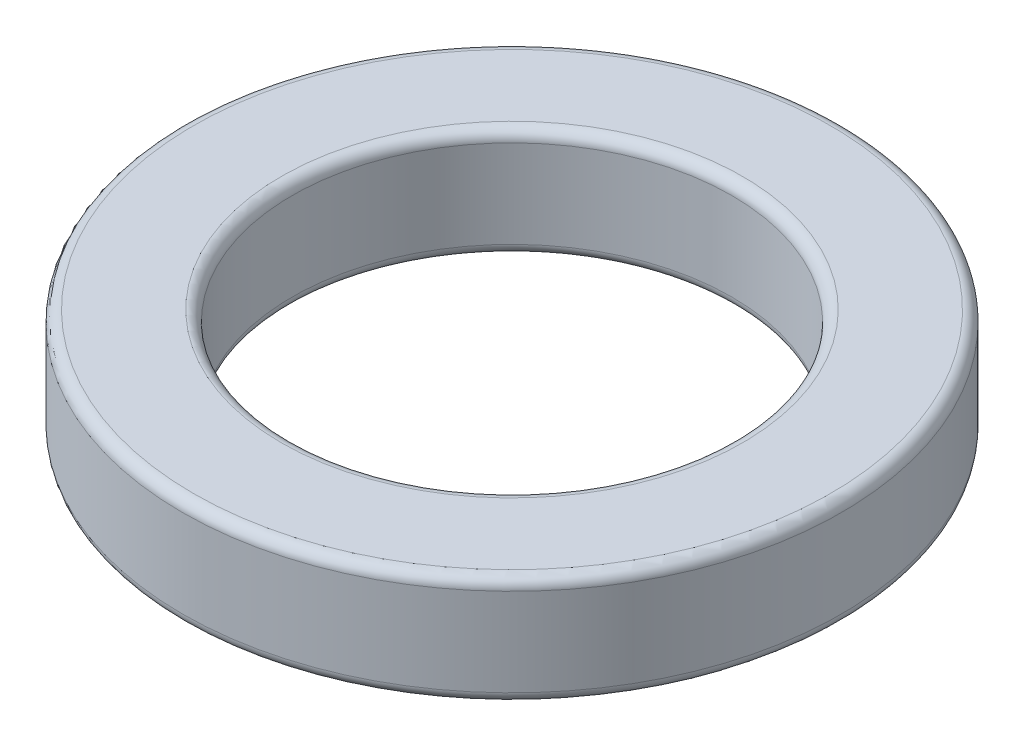
ISO-10303-21;
HEADER;
FILE_DESCRIPTION(('STEP AP214'),'2;1');
FILE_NAME('part.step','',(''),(''),'','','');
FILE_SCHEMA(('AUTOMOTIVE_DESIGN { 1 0 10303 214 1 1 1 1 }'));
ENDSEC;
DATA;
#1=APPLICATION_CONTEXT('core data for automotive mechanical design processes');
#2=APPLICATION_PROTOCOL_DEFINITION('international standard','automotive_design',2000,#1);
#3=PRODUCT_CONTEXT('',#1,'mechanical');
#4=PRODUCT('Part','Part','',(#3));
#5=PRODUCT_RELATED_PRODUCT_CATEGORY('part','',(#4));
#6=PRODUCT_DEFINITION_FORMATION('','',#4);
#7=PRODUCT_DEFINITION_CONTEXT('part definition',#1,'design');
#8=PRODUCT_DEFINITION('design','',#6,#7);
#9=PRODUCT_DEFINITION_SHAPE('','',#8);
#10=(LENGTH_UNIT() NAMED_UNIT(*) SI_UNIT(.MILLI.,.METRE.));
#11=(NAMED_UNIT(*) PLANE_ANGLE_UNIT() SI_UNIT($,.RADIAN.));
#12=(NAMED_UNIT(*) SI_UNIT($,.STERADIAN.) SOLID_ANGLE_UNIT());
#13=UNCERTAINTY_MEASURE_WITH_UNIT(LENGTH_MEASURE(1.E-05),#10,'distance_accuracy_value','');
#14=(GEOMETRIC_REPRESENTATION_CONTEXT(3) GLOBAL_UNCERTAINTY_ASSIGNED_CONTEXT((#13)) GLOBAL_UNIT_ASSIGNED_CONTEXT((#10,
#11,#12)) REPRESENTATION_CONTEXT('',''));
#15=CARTESIAN_POINT('',(0.,0.,0.));
#16=DIRECTION('',(0.,0.,1.));
#17=DIRECTION('',(1.,0.,0.));
#18=AXIS2_PLACEMENT_3D('',#15,#16,#17);
#19=CARTESIAN_POINT('',(0.,1.,0.));
#20=DIRECTION('',(0.,1.,0.));
#21=DIRECTION('',(0.,0.,1.));
#22=AXIS2_PLACEMENT_3D('',#19,#20,#21);
#23=PLANE('',#22);
#24=CARTESIAN_POINT('',(0.,1.,0.));
#25=DIRECTION('',(0.,1.,0.));
#26=DIRECTION('',(0.,0.,1.));
#27=AXIS2_PLACEMENT_3D('',#24,#25,#26);
#28=CIRCLE('',#27,2.1);
#29=CARTESIAN_POINT('',(0.,1.,2.1));
#30=VERTEX_POINT('',#29);
#31=EDGE_CURVE('E44',#30,#30,#28,.F.);
#32=ORIENTED_EDGE('',*,*,#31,.T.);
#33=EDGE_LOOP('',(#32));
#34=FACE_BOUND('',#33,.T.);
#35=CARTESIAN_POINT('',(0.,1.,0.));
#36=DIRECTION('',(0.,1.,0.));
#37=DIRECTION('',(0.,0.,1.));
#38=AXIS2_PLACEMENT_3D('',#35,#36,#37);
#39=CIRCLE('',#38,2.9);
#40=CARTESIAN_POINT('',(0.,1.,2.9));
#41=VERTEX_POINT('',#40);
#42=EDGE_CURVE('E48',#41,#41,#39,.T.);
#43=ORIENTED_EDGE('',*,*,#42,.T.);
#44=EDGE_LOOP('',(#43));
#45=FACE_BOUND('',#44,.T.);
#46=ADVANCED_FACE('F33',(#34,#45),#23,.T.);
#47=CARTESIAN_POINT('',(0.,0.,0.));
#48=DIRECTION('',(0.,1.,0.));
#49=DIRECTION('',(0.,0.,1.));
#50=AXIS2_PLACEMENT_3D('',#47,#48,#49);
#51=PLANE('',#50);
#52=CARTESIAN_POINT('',(0.,0.,0.));
#53=DIRECTION('',(0.,1.,0.));
#54=DIRECTION('',(0.,0.,1.));
#55=AXIS2_PLACEMENT_3D('',#52,#53,#54);
#56=CIRCLE('',#55,2.1);
#57=CARTESIAN_POINT('',(0.,0.,2.1));
#58=VERTEX_POINT('',#57);
#59=EDGE_CURVE('E59',#58,#58,#56,.T.);
#60=ORIENTED_EDGE('',*,*,#59,.T.);
#61=EDGE_LOOP('',(#60));
#62=FACE_BOUND('',#61,.T.);
#63=CARTESIAN_POINT('',(0.,0.,0.));
#64=DIRECTION('',(0.,1.,0.));
#65=DIRECTION('',(0.,0.,1.));
#66=AXIS2_PLACEMENT_3D('',#63,#64,#65);
#67=CIRCLE('',#66,2.9);
#68=CARTESIAN_POINT('',(0.,0.,2.9));
#69=VERTEX_POINT('',#68);
#70=EDGE_CURVE('E62',#69,#69,#67,.F.);
#71=ORIENTED_EDGE('',*,*,#70,.T.);
#72=EDGE_LOOP('',(#71));
#73=FACE_BOUND('',#72,.T.);
#74=ADVANCED_FACE('F66',(#62,#73),#51,.F.);
#75=CARTESIAN_POINT('',(0.,1.,0.));
#76=DIRECTION('',(0.,-1.,0.));
#77=DIRECTION('',(0.,0.,-1.));
#78=AXIS2_PLACEMENT_3D('',#75,#76,#77);
#79=CYLINDRICAL_SURFACE('',#78,3.);
#80=CARTESIAN_POINT('',(0.,0.1,0.));
#81=DIRECTION('',(0.,1.,0.));
#82=DIRECTION('',(0.,0.,1.));
#83=AXIS2_PLACEMENT_3D('',#80,#81,#82);
#84=CIRCLE('',#83,3.);
#85=CARTESIAN_POINT('',(0.,0.1,3.));
#86=VERTEX_POINT('',#85);
#87=EDGE_CURVE('E10',#86,#86,#84,.T.);
#88=ORIENTED_EDGE('',*,*,#87,.T.);
#89=EDGE_LOOP('',(#88));
#90=FACE_BOUND('',#89,.T.);
#91=CARTESIAN_POINT('',(0.,0.9,0.));
#92=DIRECTION('',(0.,1.,0.));
#93=DIRECTION('',(0.,0.,1.));
#94=AXIS2_PLACEMENT_3D('',#91,#92,#93);
#95=CIRCLE('',#94,3.);
#96=CARTESIAN_POINT('',(0.,0.9,3.));
#97=VERTEX_POINT('',#96);
#98=EDGE_CURVE('E40',#97,#97,#95,.F.);
#99=ORIENTED_EDGE('',*,*,#98,.T.);
#100=EDGE_LOOP('',(#99));
#101=FACE_BOUND('',#100,.T.);
#102=ADVANCED_FACE('F86',(#90,#101),#79,.T.);
#103=CARTESIAN_POINT('',(0.,1.,0.));
#104=DIRECTION('',(0.,-1.,0.));
#105=DIRECTION('',(0.,0.,-1.));
#106=AXIS2_PLACEMENT_3D('',#103,#104,#105);
#107=CYLINDRICAL_SURFACE('',#106,2.);
#108=CARTESIAN_POINT('',(0.,0.1,0.));
#109=DIRECTION('',(0.,1.,0.));
#110=DIRECTION('',(0.,0.,1.));
#111=AXIS2_PLACEMENT_3D('',#108,#109,#110);
#112=CIRCLE('',#111,2.);
#113=CARTESIAN_POINT('',(0.,0.1,2.));
#114=VERTEX_POINT('',#113);
#115=EDGE_CURVE('E53',#114,#114,#112,.F.);
#116=ORIENTED_EDGE('',*,*,#115,.T.);
#117=EDGE_LOOP('',(#116));
#118=FACE_BOUND('',#117,.T.);
#119=CARTESIAN_POINT('',(0.,0.9,0.));
#120=DIRECTION('',(0.,1.,0.));
#121=DIRECTION('',(0.,0.,1.));
#122=AXIS2_PLACEMENT_3D('',#119,#120,#121);
#123=CIRCLE('',#122,2.);
#124=CARTESIAN_POINT('',(0.,0.9,2.));
#125=VERTEX_POINT('',#124);
#126=EDGE_CURVE('E56',#125,#125,#123,.T.);
#127=ORIENTED_EDGE('',*,*,#126,.T.);
#128=EDGE_LOOP('',(#127));
#129=FACE_BOUND('',#128,.T.);
#130=ADVANCED_FACE('F91',(#118,#129),#107,.F.);
#131=CARTESIAN_POINT('',(0.,0.1,0.));
#132=DIRECTION('',(0.,1.,0.));
#133=DIRECTION('',(0.,0.,1.));
#134=AXIS2_PLACEMENT_3D('',#131,#132,#133);
#135=TOROIDAL_SURFACE('',#134,2.1,0.1);
#136=ORIENTED_EDGE('',*,*,#115,.F.);
#137=EDGE_LOOP('',(#136));
#138=FACE_BOUND('',#137,.T.);
#139=ORIENTED_EDGE('',*,*,#59,.F.);
#140=EDGE_LOOP('',(#139));
#141=FACE_BOUND('',#140,.T.);
#142=ADVANCED_FACE('F77',(#138,#141),#135,.T.);
#143=CARTESIAN_POINT('',(0.,0.9,0.));
#144=DIRECTION('',(0.,1.,0.));
#145=DIRECTION('',(0.,0.,1.));
#146=AXIS2_PLACEMENT_3D('',#143,#144,#145);
#147=TOROIDAL_SURFACE('',#146,2.1,0.1);
#148=ORIENTED_EDGE('',*,*,#31,.F.);
#149=EDGE_LOOP('',(#148));
#150=FACE_BOUND('',#149,.T.);
#151=ORIENTED_EDGE('',*,*,#126,.F.);
#152=EDGE_LOOP('',(#151));
#153=FACE_BOUND('',#152,.T.);
#154=ADVANCED_FACE('F71',(#150,#153),#147,.T.);
#155=CARTESIAN_POINT('',(0.,0.1,0.));
#156=DIRECTION('',(0.,1.,0.));
#157=DIRECTION('',(0.,0.,1.));
#158=AXIS2_PLACEMENT_3D('',#155,#156,#157);
#159=TOROIDAL_SURFACE('',#158,2.9,0.1);
#160=ORIENTED_EDGE('',*,*,#70,.F.);
#161=EDGE_LOOP('',(#160));
#162=FACE_BOUND('',#161,.T.);
#163=ORIENTED_EDGE('',*,*,#87,.F.);
#164=EDGE_LOOP('',(#163));
#165=FACE_BOUND('',#164,.T.);
#166=ADVANCED_FACE('F68',(#162,#165),#159,.T.);
#167=CARTESIAN_POINT('',(0.,0.9,0.));
#168=DIRECTION('',(0.,1.,0.));
#169=DIRECTION('',(0.,0.,1.));
#170=AXIS2_PLACEMENT_3D('',#167,#168,#169);
#171=TOROIDAL_SURFACE('',#170,2.9,0.1);
#172=ORIENTED_EDGE('',*,*,#98,.F.);
#173=EDGE_LOOP('',(#172));
#174=FACE_BOUND('',#173,.T.);
#175=ORIENTED_EDGE('',*,*,#42,.F.);
#176=EDGE_LOOP('',(#175));
#177=FACE_BOUND('',#176,.T.);
#178=ADVANCED_FACE('F35',(#174,#177),#171,.T.);
#179=CLOSED_SHELL('',(#46,#74,#102,#130,#142,#154,#166,#178));
#180=MANIFOLD_SOLID_BREP('B2',#179);
#181=ADVANCED_BREP_SHAPE_REPRESENTATION('',(#18,#180),#14);
#182=SHAPE_DEFINITION_REPRESENTATION(#9,#181);
ENDSEC;
END-ISO-10303-21;
